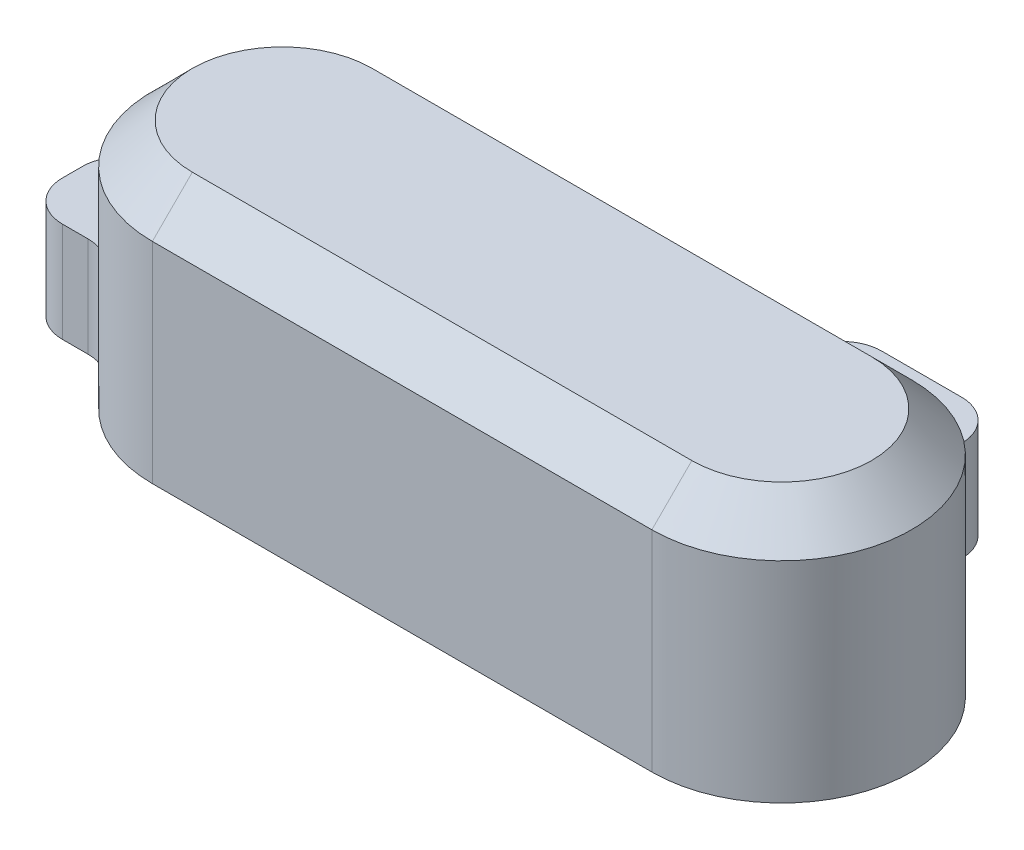
ISO-10303-21;
HEADER;
FILE_DESCRIPTION(('STEP AP214'),'2;1');
FILE_NAME('part.step','',(''),(''),'','','');
FILE_SCHEMA(('AUTOMOTIVE_DESIGN { 1 0 10303 214 1 1 1 1 }'));
ENDSEC;
DATA;
#1=APPLICATION_CONTEXT('core data for automotive mechanical design processes');
#2=APPLICATION_PROTOCOL_DEFINITION('international standard','automotive_design',2000,#1);
#3=PRODUCT_CONTEXT('',#1,'mechanical');
#4=PRODUCT('Part','Part','',(#3));
#5=PRODUCT_RELATED_PRODUCT_CATEGORY('part','',(#4));
#6=PRODUCT_DEFINITION_FORMATION('','',#4);
#7=PRODUCT_DEFINITION_CONTEXT('part definition',#1,'design');
#8=PRODUCT_DEFINITION('design','',#6,#7);
#9=PRODUCT_DEFINITION_SHAPE('','',#8);
#10=(LENGTH_UNIT() NAMED_UNIT(*) SI_UNIT(.MILLI.,.METRE.));
#11=(NAMED_UNIT(*) PLANE_ANGLE_UNIT() SI_UNIT($,.RADIAN.));
#12=(NAMED_UNIT(*) SI_UNIT($,.STERADIAN.) SOLID_ANGLE_UNIT());
#13=UNCERTAINTY_MEASURE_WITH_UNIT(LENGTH_MEASURE(1.E-05),#10,'distance_accuracy_value','');
#14=(GEOMETRIC_REPRESENTATION_CONTEXT(3) GLOBAL_UNCERTAINTY_ASSIGNED_CONTEXT((#13)) GLOBAL_UNIT_ASSIGNED_CONTEXT((#10,
#11,#12)) REPRESENTATION_CONTEXT('',''));
#15=CARTESIAN_POINT('',(0.,0.,0.));
#16=DIRECTION('',(0.,0.,1.));
#17=DIRECTION('',(1.,0.,0.));
#18=AXIS2_PLACEMENT_3D('',#15,#16,#17);
#19=CARTESIAN_POINT('',(-3.175,3.175,0.));
#20=DIRECTION('',(0.,-1.,0.));
#21=DIRECTION('',(0.,0.,-1.));
#22=AXIS2_PLACEMENT_3D('',#19,#20,#21);
#23=CYLINDRICAL_SURFACE('',#22,1.651);
#24=CARTESIAN_POINT('',(-3.175,1.27,0.));
#25=DIRECTION('',(0.,1.,0.));
#26=DIRECTION('',(0.,0.,1.));
#27=AXIS2_PLACEMENT_3D('',#24,#25,#26);
#28=CIRCLE('',#27,1.651);
#29=CARTESIAN_POINT('',(-4.57565062489201,1.27,-0.874058823529412));
#30=VERTEX_POINT('',#29);
#31=CARTESIAN_POINT('',(-4.57565062489201,1.27,0.874058823529411));
#32=VERTEX_POINT('',#31);
#33=EDGE_CURVE('E205',#30,#32,#28,.T.);
#34=ORIENTED_EDGE('',*,*,#33,.T.);
#35=DIRECTION('',(0.,-1.,0.));
#36=VECTOR('',#35,1.);
#37=CARTESIAN_POINT('',(-4.57565062489201,3.175,0.874058823529411));
#38=LINE('',#37,#36);
#39=CARTESIAN_POINT('',(-4.57565062489201,0.,0.874058823529411));
#40=VERTEX_POINT('',#39);
#41=EDGE_CURVE('E190',#32,#40,#38,.T.);
#42=ORIENTED_EDGE('',*,*,#41,.T.);
#43=CARTESIAN_POINT('',(-3.175,0.,0.));
#44=DIRECTION('',(0.,1.,0.));
#45=DIRECTION('',(0.,0.,1.));
#46=AXIS2_PLACEMENT_3D('',#43,#44,#45);
#47=CIRCLE('',#46,1.651);
#48=CARTESIAN_POINT('',(-3.175,0.,1.651));
#49=VERTEX_POINT('',#48);
#50=EDGE_CURVE('E186',#40,#49,#47,.T.);
#51=ORIENTED_EDGE('',*,*,#50,.T.);
#52=DIRECTION('',(0.,-1.,0.));
#53=VECTOR('',#52,1.);
#54=CARTESIAN_POINT('',(-3.175,3.175,1.651));
#55=LINE('',#54,#53);
#56=CARTESIAN_POINT('',(-3.175,2.667,1.651));
#57=VERTEX_POINT('',#56);
#58=EDGE_CURVE('E188',#57,#49,#55,.T.);
#59=ORIENTED_EDGE('',*,*,#58,.F.);
#60=CARTESIAN_POINT('',(-3.175,2.667,0.));
#61=DIRECTION('',(0.,1.,0.));
#62=DIRECTION('',(0.,0.,1.));
#63=AXIS2_PLACEMENT_3D('',#60,#61,#62);
#64=CIRCLE('',#63,1.651);
#65=CARTESIAN_POINT('',(-3.175,2.667,-1.651));
#66=VERTEX_POINT('',#65);
#67=EDGE_CURVE('E239',#57,#66,#64,.F.);
#68=ORIENTED_EDGE('',*,*,#67,.T.);
#69=DIRECTION('',(0.,-1.,0.));
#70=VECTOR('',#69,1.);
#71=CARTESIAN_POINT('',(-3.175,3.175,-1.651));
#72=LINE('',#71,#70);
#73=CARTESIAN_POINT('',(-3.175,0.,-1.651));
#74=VERTEX_POINT('',#73);
#75=EDGE_CURVE('E219',#66,#74,#72,.T.);
#76=ORIENTED_EDGE('',*,*,#75,.T.);
#77=CARTESIAN_POINT('',(-4.57565062489201,0.,-0.874058823529412));
#78=VERTEX_POINT('',#77);
#79=EDGE_CURVE('E193',#74,#78,#47,.T.);
#80=ORIENTED_EDGE('',*,*,#79,.T.);
#81=DIRECTION('',(0.,-1.,0.));
#82=VECTOR('',#81,1.);
#83=CARTESIAN_POINT('',(-4.57565062489201,3.175,-0.874058823529412));
#84=LINE('',#83,#82);
#85=EDGE_CURVE('E276',#78,#30,#84,.F.);
#86=ORIENTED_EDGE('',*,*,#85,.T.);
#87=EDGE_LOOP('',(#34,#42,#51,#59,#68,#76,#80,#86));
#88=FACE_BOUND('',#87,.T.);
#89=ADVANCED_FACE('F34',(#88),#23,.T.);
#90=CARTESIAN_POINT('',(-3.175,3.175,1.651));
#91=DIRECTION('',(0.,0.,-1.));
#92=DIRECTION('',(-1.,0.,0.));
#93=AXIS2_PLACEMENT_3D('',#90,#91,#92);
#94=PLANE('',#93);
#95=DIRECTION('',(0.,-1.,0.));
#96=VECTOR('',#95,1.);
#97=CARTESIAN_POINT('',(3.175,3.175,1.651));
#98=LINE('',#97,#96);
#99=CARTESIAN_POINT('',(3.175,2.667,1.651));
#100=VERTEX_POINT('',#99);
#101=CARTESIAN_POINT('',(3.175,0.,1.651));
#102=VERTEX_POINT('',#101);
#103=EDGE_CURVE('E206',#100,#102,#98,.T.);
#104=ORIENTED_EDGE('',*,*,#103,.F.);
#105=DIRECTION('',(-1.,0.,0.));
#106=VECTOR('',#105,1.);
#107=CARTESIAN_POINT('',(-3.175,2.667,1.651));
#108=LINE('',#107,#106);
#109=EDGE_CURVE('E204',#100,#57,#108,.T.);
#110=ORIENTED_EDGE('',*,*,#109,.T.);
#111=ORIENTED_EDGE('',*,*,#58,.T.);
#112=DIRECTION('',(1.,0.,0.));
#113=VECTOR('',#112,1.);
#114=CARTESIAN_POINT('',(-3.175,0.,1.651));
#115=LINE('',#114,#113);
#116=EDGE_CURVE('E201',#49,#102,#115,.T.);
#117=ORIENTED_EDGE('',*,*,#116,.T.);
#118=EDGE_LOOP('',(#104,#110,#111,#117));
#119=FACE_BOUND('',#118,.T.);
#120=ADVANCED_FACE('F200',(#119),#94,.F.);
#121=CARTESIAN_POINT('',(3.175,3.175,0.));
#122=DIRECTION('',(0.,-1.,0.));
#123=DIRECTION('',(0.,0.,-1.));
#124=AXIS2_PLACEMENT_3D('',#121,#122,#123);
#125=CYLINDRICAL_SURFACE('',#124,1.651);
#126=CARTESIAN_POINT('',(3.175,0.,0.));
#127=DIRECTION('',(0.,1.,0.));
#128=DIRECTION('',(0.,0.,1.));
#129=AXIS2_PLACEMENT_3D('',#126,#127,#128);
#130=CIRCLE('',#129,1.651);
#131=CARTESIAN_POINT('',(3.27211764705882,0.,-1.64814112339622));
#132=VERTEX_POINT('',#131);
#133=EDGE_CURVE('E211',#102,#132,#130,.T.);
#134=ORIENTED_EDGE('',*,*,#133,.T.);
#135=DIRECTION('',(0.,-1.,0.));
#136=VECTOR('',#135,1.);
#137=CARTESIAN_POINT('',(3.27211764705882,3.175,-1.64814112339622));
#138=LINE('',#137,#136);
#139=CARTESIAN_POINT('',(3.27211764705882,1.27,-1.64814112339622));
#140=VERTEX_POINT('',#139);
#141=EDGE_CURVE('E292',#132,#140,#138,.F.);
#142=ORIENTED_EDGE('',*,*,#141,.T.);
#143=CARTESIAN_POINT('',(3.175,1.27,0.));
#144=DIRECTION('',(0.,-1.,0.));
#145=DIRECTION('',(0.,0.,-1.));
#146=AXIS2_PLACEMENT_3D('',#143,#144,#145);
#147=CIRCLE('',#146,1.651);
#148=CARTESIAN_POINT('',(3.175,1.27,-1.651));
#149=VERTEX_POINT('',#148);
#150=EDGE_CURVE('E289',#140,#149,#147,.F.);
#151=ORIENTED_EDGE('',*,*,#150,.T.);
#152=DIRECTION('',(0.,-1.,0.));
#153=VECTOR('',#152,1.);
#154=CARTESIAN_POINT('',(3.175,3.175,-1.651));
#155=LINE('',#154,#153);
#156=CARTESIAN_POINT('',(3.175,2.667,-1.651));
#157=VERTEX_POINT('',#156);
#158=EDGE_CURVE('E222',#157,#149,#155,.T.);
#159=ORIENTED_EDGE('',*,*,#158,.F.);
#160=CARTESIAN_POINT('',(3.175,2.667,0.));
#161=DIRECTION('',(0.,1.,0.));
#162=DIRECTION('',(0.,0.,1.));
#163=AXIS2_PLACEMENT_3D('',#160,#161,#162);
#164=CIRCLE('',#163,1.651);
#165=EDGE_CURVE('E237',#157,#100,#164,.F.);
#166=ORIENTED_EDGE('',*,*,#165,.T.);
#167=ORIENTED_EDGE('',*,*,#103,.T.);
#168=EDGE_LOOP('',(#134,#142,#151,#159,#166,#167));
#169=FACE_BOUND('',#168,.T.);
#170=ADVANCED_FACE('F397',(#169),#125,.T.);
#171=CARTESIAN_POINT('',(-3.175,3.175,-1.651));
#172=DIRECTION('',(0.,0.,1.));
#173=DIRECTION('',(1.,0.,0.));
#174=AXIS2_PLACEMENT_3D('',#171,#172,#173);
#175=PLANE('',#174);
#176=ORIENTED_EDGE('',*,*,#158,.T.);
#177=DIRECTION('',(-1.,0.,0.));
#178=VECTOR('',#177,1.);
#179=CARTESIAN_POINT('',(0.762,1.27,-1.651));
#180=LINE('',#179,#178);
#181=CARTESIAN_POINT('',(0.254,1.27,-1.651));
#182=VERTEX_POINT('',#181);
#183=EDGE_CURVE('E334',#149,#182,#180,.T.);
#184=ORIENTED_EDGE('',*,*,#183,.T.);
#185=DIRECTION('',(0.,-1.,0.));
#186=VECTOR('',#185,1.);
#187=CARTESIAN_POINT('',(0.254,3.175,-1.651));
#188=LINE('',#187,#186);
#189=CARTESIAN_POINT('',(0.254,0.,-1.651));
#190=VERTEX_POINT('',#189);
#191=EDGE_CURVE('E295',#182,#190,#188,.T.);
#192=ORIENTED_EDGE('',*,*,#191,.T.);
#193=DIRECTION('',(-1.,0.,0.));
#194=VECTOR('',#193,1.);
#195=CARTESIAN_POINT('',(-3.175,0.,-1.651));
#196=LINE('',#195,#194);
#197=EDGE_CURVE('E213',#190,#74,#196,.T.);
#198=ORIENTED_EDGE('',*,*,#197,.T.);
#199=ORIENTED_EDGE('',*,*,#75,.F.);
#200=DIRECTION('',(1.,0.,0.));
#201=VECTOR('',#200,1.);
#202=CARTESIAN_POINT('',(3.175,2.667,-1.651));
#203=LINE('',#202,#201);
#204=EDGE_CURVE('E241',#66,#157,#203,.T.);
#205=ORIENTED_EDGE('',*,*,#204,.T.);
#206=EDGE_LOOP('',(#176,#184,#192,#198,#199,#205));
#207=FACE_BOUND('',#206,.T.);
#208=ADVANCED_FACE('F377',(#207),#175,.F.);
#209=CARTESIAN_POINT('',(-3.175,3.175,0.));
#210=DIRECTION('',(0.,1.,0.));
#211=DIRECTION('',(0.,0.,1.));
#212=AXIS2_PLACEMENT_3D('',#209,#210,#211);
#213=PLANE('',#212);
#214=CARTESIAN_POINT('',(-3.175,3.175,0.));
#215=DIRECTION('',(0.,1.,0.));
#216=DIRECTION('',(0.,0.,1.));
#217=AXIS2_PLACEMENT_3D('',#214,#215,#216);
#218=CIRCLE('',#217,1.143);
#219=CARTESIAN_POINT('',(-3.175,3.175,-1.143));
#220=VERTEX_POINT('',#219);
#221=CARTESIAN_POINT('',(-3.175,3.175,1.143));
#222=VERTEX_POINT('',#221);
#223=EDGE_CURVE('E229',#220,#222,#218,.T.);
#224=ORIENTED_EDGE('',*,*,#223,.T.);
#225=DIRECTION('',(1.,0.,0.));
#226=VECTOR('',#225,1.);
#227=CARTESIAN_POINT('',(3.175,3.175,1.143));
#228=LINE('',#227,#226);
#229=CARTESIAN_POINT('',(3.175,3.175,1.143));
#230=VERTEX_POINT('',#229);
#231=EDGE_CURVE('E233',#222,#230,#228,.T.);
#232=ORIENTED_EDGE('',*,*,#231,.T.);
#233=CARTESIAN_POINT('',(3.175,3.175,0.));
#234=DIRECTION('',(0.,1.,0.));
#235=DIRECTION('',(0.,0.,1.));
#236=AXIS2_PLACEMENT_3D('',#233,#234,#235);
#237=CIRCLE('',#236,1.143);
#238=CARTESIAN_POINT('',(3.175,3.175,-1.143));
#239=VERTEX_POINT('',#238);
#240=EDGE_CURVE('E231',#230,#239,#237,.T.);
#241=ORIENTED_EDGE('',*,*,#240,.T.);
#242=DIRECTION('',(-1.,0.,0.));
#243=VECTOR('',#242,1.);
#244=CARTESIAN_POINT('',(-3.175,3.175,-1.143));
#245=LINE('',#244,#243);
#246=EDGE_CURVE('E227',#239,#220,#245,.T.);
#247=ORIENTED_EDGE('',*,*,#246,.T.);
#248=EDGE_LOOP('',(#224,#232,#241,#247));
#249=FACE_BOUND('',#248,.T.);
#250=ADVANCED_FACE('F391',(#249),#213,.T.);
#251=CARTESIAN_POINT('',(-3.175,0.,0.));
#252=DIRECTION('',(0.,1.,0.));
#253=DIRECTION('',(0.,0.,1.));
#254=AXIS2_PLACEMENT_3D('',#251,#252,#253);
#255=PLANE('',#254);
#256=DIRECTION('',(-1.,0.,0.));
#257=VECTOR('',#256,1.);
#258=CARTESIAN_POINT('',(-3.81,0.,0.635));
#259=LINE('',#258,#257);
#260=CARTESIAN_POINT('',(-5.00662004793571,0.,0.634999999999999));
#261=VERTEX_POINT('',#260);
#262=CARTESIAN_POINT('',(-5.334,0.,0.634999999999999));
#263=VERTEX_POINT('',#262);
#264=EDGE_CURVE('E347',#261,#263,#259,.T.);
#265=ORIENTED_EDGE('',*,*,#264,.T.);
#266=CARTESIAN_POINT('',(-5.334,0.,0.126999999999999));
#267=DIRECTION('',(0.,1.,0.));
#268=DIRECTION('',(0.,0.,1.));
#269=AXIS2_PLACEMENT_3D('',#266,#267,#268);
#270=CIRCLE('',#269,0.508);
#271=CARTESIAN_POINT('',(-5.842,0.,0.126999999999999));
#272=VERTEX_POINT('',#271);
#273=EDGE_CURVE('E265',#263,#272,#270,.F.);
#274=ORIENTED_EDGE('',*,*,#273,.T.);
#275=DIRECTION('',(0.,0.,-1.));
#276=VECTOR('',#275,1.);
#277=CARTESIAN_POINT('',(-5.842,0.,0.634999999999999));
#278=LINE('',#277,#276);
#279=CARTESIAN_POINT('',(-5.842,0.,-0.127));
#280=VERTEX_POINT('',#279);
#281=EDGE_CURVE('E361',#272,#280,#278,.T.);
#282=ORIENTED_EDGE('',*,*,#281,.T.);
#283=CARTESIAN_POINT('',(-5.334,0.,-0.127));
#284=DIRECTION('',(0.,1.,0.));
#285=DIRECTION('',(0.,0.,1.));
#286=AXIS2_PLACEMENT_3D('',#283,#284,#285);
#287=CIRCLE('',#286,0.508);
#288=CARTESIAN_POINT('',(-5.334,0.,-0.635));
#289=VERTEX_POINT('',#288);
#290=EDGE_CURVE('E263',#280,#289,#287,.F.);
#291=ORIENTED_EDGE('',*,*,#290,.T.);
#292=DIRECTION('',(1.,0.,0.));
#293=VECTOR('',#292,1.);
#294=CARTESIAN_POINT('',(-3.81,0.,-0.635));
#295=LINE('',#294,#293);
#296=CARTESIAN_POINT('',(-5.00662004793571,0.,-0.635));
#297=VERTEX_POINT('',#296);
#298=EDGE_CURVE('E355',#289,#297,#295,.T.);
#299=ORIENTED_EDGE('',*,*,#298,.T.);
#300=CARTESIAN_POINT('',(-5.00662004793571,0.,-1.143));
#301=DIRECTION('',(0.,1.,0.));
#302=DIRECTION('',(0.,0.,1.));
#303=AXIS2_PLACEMENT_3D('',#300,#301,#302);
#304=CIRCLE('',#303,0.508);
#305=EDGE_CURVE('E317',#297,#78,#304,.T.);
#306=ORIENTED_EDGE('',*,*,#305,.T.);
#307=ORIENTED_EDGE('',*,*,#79,.F.);
#308=ORIENTED_EDGE('',*,*,#197,.F.);
#309=CARTESIAN_POINT('',(0.254,0.,-2.159));
#310=DIRECTION('',(0.,1.,0.));
#311=DIRECTION('',(0.,0.,1.));
#312=AXIS2_PLACEMENT_3D('',#309,#310,#311);
#313=CIRCLE('',#312,0.508);
#314=CARTESIAN_POINT('',(0.762,0.,-2.159));
#315=VERTEX_POINT('',#314);
#316=EDGE_CURVE('E42',#190,#315,#313,.T.);
#317=ORIENTED_EDGE('',*,*,#316,.T.);
#318=DIRECTION('',(0.,0.,-1.));
#319=VECTOR('',#318,1.);
#320=CARTESIAN_POINT('',(0.762,0.,-1.651));
#321=LINE('',#320,#319);
#322=CARTESIAN_POINT('',(0.762,0.,-2.667));
#323=VERTEX_POINT('',#322);
#324=EDGE_CURVE('E254',#315,#323,#321,.T.);
#325=ORIENTED_EDGE('',*,*,#324,.T.);
#326=CARTESIAN_POINT('',(1.27,0.,-2.667));
#327=DIRECTION('',(0.,1.,0.));
#328=DIRECTION('',(0.,0.,1.));
#329=AXIS2_PLACEMENT_3D('',#326,#327,#328);
#330=CIRCLE('',#329,0.508);
#331=CARTESIAN_POINT('',(1.27,0.,-3.175));
#332=VERTEX_POINT('',#331);
#333=EDGE_CURVE('E259',#323,#332,#330,.F.);
#334=ORIENTED_EDGE('',*,*,#333,.T.);
#335=DIRECTION('',(1.,0.,0.));
#336=VECTOR('',#335,1.);
#337=CARTESIAN_POINT('',(0.762,0.,-3.175));
#338=LINE('',#337,#336);
#339=CARTESIAN_POINT('',(2.286,0.,-3.175));
#340=VERTEX_POINT('',#339);
#341=EDGE_CURVE('E329',#332,#340,#338,.T.);
#342=ORIENTED_EDGE('',*,*,#341,.T.);
#343=CARTESIAN_POINT('',(2.286,0.,-2.667));
#344=DIRECTION('',(0.,1.,0.));
#345=DIRECTION('',(0.,0.,1.));
#346=AXIS2_PLACEMENT_3D('',#343,#344,#345);
#347=CIRCLE('',#346,0.508);
#348=CARTESIAN_POINT('',(2.794,0.,-2.667));
#349=VERTEX_POINT('',#348);
#350=EDGE_CURVE('E261',#340,#349,#347,.F.);
#351=ORIENTED_EDGE('',*,*,#350,.T.);
#352=DIRECTION('',(0.,0.,1.));
#353=VECTOR('',#352,1.);
#354=CARTESIAN_POINT('',(2.794,0.,-1.651));
#355=LINE('',#354,#353);
#356=CARTESIAN_POINT('',(2.794,0.,-2.1552614690566));
#357=VERTEX_POINT('',#356);
#358=EDGE_CURVE('E337',#349,#357,#355,.T.);
#359=ORIENTED_EDGE('',*,*,#358,.T.);
#360=CARTESIAN_POINT('',(3.302,0.,-2.1552614690566));
#361=DIRECTION('',(0.,1.,0.));
#362=DIRECTION('',(0.,0.,1.));
#363=AXIS2_PLACEMENT_3D('',#360,#361,#362);
#364=CIRCLE('',#363,0.508);
#365=EDGE_CURVE('E319',#357,#132,#364,.T.);
#366=ORIENTED_EDGE('',*,*,#365,.T.);
#367=ORIENTED_EDGE('',*,*,#133,.F.);
#368=ORIENTED_EDGE('',*,*,#116,.F.);
#369=ORIENTED_EDGE('',*,*,#50,.F.);
#370=CARTESIAN_POINT('',(-5.00662004793571,0.,1.143));
#371=DIRECTION('',(0.,1.,0.));
#372=DIRECTION('',(0.,0.,1.));
#373=AXIS2_PLACEMENT_3D('',#370,#371,#372);
#374=CIRCLE('',#373,0.508);
#375=EDGE_CURVE('E310',#40,#261,#374,.T.);
#376=ORIENTED_EDGE('',*,*,#375,.T.);
#377=EDGE_LOOP('',(#265,#274,#282,#291,#299,#306,#307,#308,#317,#325,#334,#342,#351,#359,#366,
#367,#368,#369,#376));
#378=FACE_BOUND('',#377,.T.);
#379=ADVANCED_FACE('F209',(#378),#255,.F.);
#380=CARTESIAN_POINT('',(-3.81,1.27,-0.635));
#381=DIRECTION('',(0.,0.,-1.));
#382=DIRECTION('',(-1.,0.,0.));
#383=AXIS2_PLACEMENT_3D('',#380,#381,#382);
#384=PLANE('',#383);
#385=DIRECTION('',(1.,0.,0.));
#386=VECTOR('',#385,1.);
#387=CARTESIAN_POINT('',(-3.81,1.27,-0.635));
#388=LINE('',#387,#386);
#389=CARTESIAN_POINT('',(-5.334,1.27,-0.635));
#390=VERTEX_POINT('',#389);
#391=CARTESIAN_POINT('',(-5.00662004793571,1.27,-0.635));
#392=VERTEX_POINT('',#391);
#393=EDGE_CURVE('E194',#390,#392,#388,.T.);
#394=ORIENTED_EDGE('',*,*,#393,.T.);
#395=DIRECTION('',(0.,-1.,0.));
#396=VECTOR('',#395,1.);
#397=CARTESIAN_POINT('',(-5.00662004793571,1.27,-0.635));
#398=LINE('',#397,#396);
#399=EDGE_CURVE('E282',#392,#297,#398,.T.);
#400=ORIENTED_EDGE('',*,*,#399,.T.);
#401=ORIENTED_EDGE('',*,*,#298,.F.);
#402=DIRECTION('',(0.,-1.,0.));
#403=VECTOR('',#402,1.);
#404=CARTESIAN_POINT('',(-5.334,1.27,-0.635));
#405=LINE('',#404,#403);
#406=EDGE_CURVE('E280',#289,#390,#405,.F.);
#407=ORIENTED_EDGE('',*,*,#406,.T.);
#408=EDGE_LOOP('',(#394,#400,#401,#407));
#409=FACE_BOUND('',#408,.T.);
#410=ADVANCED_FACE('F424',(#409),#384,.T.);
#411=CARTESIAN_POINT('',(-3.81,1.27,0.635));
#412=DIRECTION('',(0.,0.,1.));
#413=DIRECTION('',(1.,0.,0.));
#414=AXIS2_PLACEMENT_3D('',#411,#412,#413);
#415=PLANE('',#414);
#416=DIRECTION('',(-1.,0.,0.));
#417=VECTOR('',#416,1.);
#418=CARTESIAN_POINT('',(-3.81,1.27,0.635));
#419=LINE('',#418,#417);
#420=CARTESIAN_POINT('',(-5.00662004793571,1.27,0.634999999999999));
#421=VERTEX_POINT('',#420);
#422=CARTESIAN_POINT('',(-5.334,1.27,0.634999999999999));
#423=VERTEX_POINT('',#422);
#424=EDGE_CURVE('E351',#421,#423,#419,.T.);
#425=ORIENTED_EDGE('',*,*,#424,.T.);
#426=DIRECTION('',(0.,-1.,0.));
#427=VECTOR('',#426,1.);
#428=CARTESIAN_POINT('',(-5.334,1.27,0.634999999999999));
#429=LINE('',#428,#427);
#430=EDGE_CURVE('E256',#423,#263,#429,.T.);
#431=ORIENTED_EDGE('',*,*,#430,.T.);
#432=ORIENTED_EDGE('',*,*,#264,.F.);
#433=DIRECTION('',(0.,-1.,0.));
#434=VECTOR('',#433,1.);
#435=CARTESIAN_POINT('',(-5.00662004793571,1.27,0.634999999999999));
#436=LINE('',#435,#434);
#437=EDGE_CURVE('E243',#261,#421,#436,.F.);
#438=ORIENTED_EDGE('',*,*,#437,.T.);
#439=EDGE_LOOP('',(#425,#431,#432,#438));
#440=FACE_BOUND('',#439,.T.);
#441=ADVANCED_FACE('F427',(#440),#415,.T.);
#442=CARTESIAN_POINT('',(-5.842,1.27,0.634999999999999));
#443=DIRECTION('',(-1.,0.,0.));
#444=DIRECTION('',(0.,0.,1.));
#445=AXIS2_PLACEMENT_3D('',#442,#443,#444);
#446=PLANE('',#445);
#447=ORIENTED_EDGE('',*,*,#281,.F.);
#448=DIRECTION('',(0.,-1.,0.));
#449=VECTOR('',#448,1.);
#450=CARTESIAN_POINT('',(-5.842,1.27,0.126999999999999));
#451=LINE('',#450,#449);
#452=CARTESIAN_POINT('',(-5.842,1.27,0.126999999999999));
#453=VERTEX_POINT('',#452);
#454=EDGE_CURVE('E270',#272,#453,#451,.F.);
#455=ORIENTED_EDGE('',*,*,#454,.T.);
#456=DIRECTION('',(0.,0.,-1.));
#457=VECTOR('',#456,1.);
#458=CARTESIAN_POINT('',(-5.842,1.27,0.634999999999999));
#459=LINE('',#458,#457);
#460=CARTESIAN_POINT('',(-5.842,1.27,-0.127));
#461=VERTEX_POINT('',#460);
#462=EDGE_CURVE('E354',#453,#461,#459,.T.);
#463=ORIENTED_EDGE('',*,*,#462,.T.);
#464=DIRECTION('',(0.,-1.,0.));
#465=VECTOR('',#464,1.);
#466=CARTESIAN_POINT('',(-5.842,1.27,-0.127));
#467=LINE('',#466,#465);
#468=EDGE_CURVE('E267',#461,#280,#467,.T.);
#469=ORIENTED_EDGE('',*,*,#468,.T.);
#470=EDGE_LOOP('',(#447,#455,#463,#469));
#471=FACE_BOUND('',#470,.T.);
#472=ADVANCED_FACE('F430',(#471),#446,.T.);
#473=CARTESIAN_POINT('',(0.,1.27,0.));
#474=DIRECTION('',(0.,1.,0.));
#475=DIRECTION('',(0.,0.,1.));
#476=AXIS2_PLACEMENT_3D('',#473,#474,#475);
#477=PLANE('',#476);
#478=ORIENTED_EDGE('',*,*,#462,.F.);
#479=CARTESIAN_POINT('',(-5.334,1.27,0.126999999999999));
#480=DIRECTION('',(0.,1.,0.));
#481=DIRECTION('',(0.,0.,1.));
#482=AXIS2_PLACEMENT_3D('',#479,#480,#481);
#483=CIRCLE('',#482,0.508);
#484=EDGE_CURVE('E274',#453,#423,#483,.T.);
#485=ORIENTED_EDGE('',*,*,#484,.T.);
#486=ORIENTED_EDGE('',*,*,#424,.F.);
#487=CARTESIAN_POINT('',(-5.00662004793571,1.27,1.143));
#488=DIRECTION('',(0.,1.,0.));
#489=DIRECTION('',(0.,0.,1.));
#490=AXIS2_PLACEMENT_3D('',#487,#488,#489);
#491=CIRCLE('',#490,0.508);
#492=EDGE_CURVE('E312',#421,#32,#491,.F.);
#493=ORIENTED_EDGE('',*,*,#492,.T.);
#494=ORIENTED_EDGE('',*,*,#33,.F.);
#495=CARTESIAN_POINT('',(-5.00662004793571,1.27,-1.143));
#496=DIRECTION('',(0.,1.,0.));
#497=DIRECTION('',(0.,0.,1.));
#498=AXIS2_PLACEMENT_3D('',#495,#496,#497);
#499=CIRCLE('',#498,0.508);
#500=EDGE_CURVE('E315',#30,#392,#499,.F.);
#501=ORIENTED_EDGE('',*,*,#500,.T.);
#502=ORIENTED_EDGE('',*,*,#393,.F.);
#503=CARTESIAN_POINT('',(-5.334,1.27,-0.127));
#504=DIRECTION('',(0.,1.,0.));
#505=DIRECTION('',(0.,0.,1.));
#506=AXIS2_PLACEMENT_3D('',#503,#504,#505);
#507=CIRCLE('',#506,0.508);
#508=EDGE_CURVE('E272',#390,#461,#507,.T.);
#509=ORIENTED_EDGE('',*,*,#508,.T.);
#510=EDGE_LOOP('',(#478,#485,#486,#493,#494,#501,#502,#509));
#511=FACE_BOUND('',#510,.T.);
#512=ADVANCED_FACE('F434',(#511),#477,.T.);
#513=CARTESIAN_POINT('',(0.762,1.27,-1.651));
#514=DIRECTION('',(-1.,0.,0.));
#515=DIRECTION('',(0.,0.,1.));
#516=AXIS2_PLACEMENT_3D('',#513,#514,#515);
#517=PLANE('',#516);
#518=DIRECTION('',(0.,0.,-1.));
#519=VECTOR('',#518,1.);
#520=CARTESIAN_POINT('',(0.762,1.27,-1.651));
#521=LINE('',#520,#519);
#522=CARTESIAN_POINT('',(0.762,1.27,-2.159));
#523=VERTEX_POINT('',#522);
#524=CARTESIAN_POINT('',(0.762,1.27,-2.667));
#525=VERTEX_POINT('',#524);
#526=EDGE_CURVE('E335',#523,#525,#521,.T.);
#527=ORIENTED_EDGE('',*,*,#526,.T.);
#528=DIRECTION('',(0.,-1.,0.));
#529=VECTOR('',#528,1.);
#530=CARTESIAN_POINT('',(0.762,1.27,-2.667));
#531=LINE('',#530,#529);
#532=EDGE_CURVE('E307',#525,#323,#531,.T.);
#533=ORIENTED_EDGE('',*,*,#532,.T.);
#534=ORIENTED_EDGE('',*,*,#324,.F.);
#535=DIRECTION('',(0.,-1.,0.));
#536=VECTOR('',#535,1.);
#537=CARTESIAN_POINT('',(0.762,1.27,-2.159));
#538=LINE('',#537,#536);
#539=EDGE_CURVE('E56',#315,#523,#538,.F.);
#540=ORIENTED_EDGE('',*,*,#539,.T.);
#541=EDGE_LOOP('',(#527,#533,#534,#540));
#542=FACE_BOUND('',#541,.T.);
#543=ADVANCED_FACE('F327',(#542),#517,.T.);
#544=CARTESIAN_POINT('',(2.794,1.27,-1.651));
#545=DIRECTION('',(1.,0.,0.));
#546=DIRECTION('',(0.,0.,-1.));
#547=AXIS2_PLACEMENT_3D('',#544,#545,#546);
#548=PLANE('',#547);
#549=DIRECTION('',(0.,0.,1.));
#550=VECTOR('',#549,1.);
#551=CARTESIAN_POINT('',(2.794,1.27,-1.651));
#552=LINE('',#551,#550);
#553=CARTESIAN_POINT('',(2.794,1.27,-2.667));
#554=VERTEX_POINT('',#553);
#555=CARTESIAN_POINT('',(2.794,1.27,-2.1552614690566));
#556=VERTEX_POINT('',#555);
#557=EDGE_CURVE('E340',#554,#556,#552,.T.);
#558=ORIENTED_EDGE('',*,*,#557,.T.);
#559=DIRECTION('',(0.,-1.,0.));
#560=VECTOR('',#559,1.);
#561=CARTESIAN_POINT('',(2.794,1.27,-2.1552614690566));
#562=LINE('',#561,#560);
#563=EDGE_CURVE('E286',#556,#357,#562,.T.);
#564=ORIENTED_EDGE('',*,*,#563,.T.);
#565=ORIENTED_EDGE('',*,*,#358,.F.);
#566=DIRECTION('',(0.,-1.,0.));
#567=VECTOR('',#566,1.);
#568=CARTESIAN_POINT('',(2.794,1.27,-2.667));
#569=LINE('',#568,#567);
#570=EDGE_CURVE('E284',#349,#554,#569,.F.);
#571=ORIENTED_EDGE('',*,*,#570,.T.);
#572=EDGE_LOOP('',(#558,#564,#565,#571));
#573=FACE_BOUND('',#572,.T.);
#574=ADVANCED_FACE('F443',(#573),#548,.T.);
#575=CARTESIAN_POINT('',(0.762,1.27,-3.175));
#576=DIRECTION('',(0.,0.,-1.));
#577=DIRECTION('',(-1.,0.,0.));
#578=AXIS2_PLACEMENT_3D('',#575,#576,#577);
#579=PLANE('',#578);
#580=DIRECTION('',(1.,0.,0.));
#581=VECTOR('',#580,1.);
#582=CARTESIAN_POINT('',(0.762,1.27,-3.175));
#583=LINE('',#582,#581);
#584=CARTESIAN_POINT('',(1.27,1.27,-3.175));
#585=VERTEX_POINT('',#584);
#586=CARTESIAN_POINT('',(2.286,1.27,-3.175));
#587=VERTEX_POINT('',#586);
#588=EDGE_CURVE('E336',#585,#587,#583,.T.);
#589=ORIENTED_EDGE('',*,*,#588,.T.);
#590=DIRECTION('',(0.,-1.,0.));
#591=VECTOR('',#590,1.);
#592=CARTESIAN_POINT('',(2.286,1.27,-3.175));
#593=LINE('',#592,#591);
#594=EDGE_CURVE('E300',#587,#340,#593,.T.);
#595=ORIENTED_EDGE('',*,*,#594,.T.);
#596=ORIENTED_EDGE('',*,*,#341,.F.);
#597=DIRECTION('',(0.,-1.,0.));
#598=VECTOR('',#597,1.);
#599=CARTESIAN_POINT('',(1.27,1.27,-3.175));
#600=LINE('',#599,#598);
#601=EDGE_CURVE('E298',#332,#585,#600,.F.);
#602=ORIENTED_EDGE('',*,*,#601,.T.);
#603=EDGE_LOOP('',(#589,#595,#596,#602));
#604=FACE_BOUND('',#603,.T.);
#605=ADVANCED_FACE('F444',(#604),#579,.T.);
#606=CARTESIAN_POINT('',(0.,1.27,0.));
#607=DIRECTION('',(0.,-1.,0.));
#608=DIRECTION('',(0.,0.,-1.));
#609=AXIS2_PLACEMENT_3D('',#606,#607,#608);
#610=PLANE('',#609);
#611=ORIENTED_EDGE('',*,*,#557,.F.);
#612=CARTESIAN_POINT('',(2.286,1.27,-2.667));
#613=DIRECTION('',(0.,-1.,0.));
#614=DIRECTION('',(0.,0.,-1.));
#615=AXIS2_PLACEMENT_3D('',#612,#613,#614);
#616=CIRCLE('',#615,0.508);
#617=EDGE_CURVE('E304',#554,#587,#616,.F.);
#618=ORIENTED_EDGE('',*,*,#617,.T.);
#619=ORIENTED_EDGE('',*,*,#588,.F.);
#620=CARTESIAN_POINT('',(1.27,1.27,-2.667));
#621=DIRECTION('',(0.,-1.,0.));
#622=DIRECTION('',(0.,0.,-1.));
#623=AXIS2_PLACEMENT_3D('',#620,#621,#622);
#624=CIRCLE('',#623,0.508);
#625=EDGE_CURVE('E49',#585,#525,#624,.F.);
#626=ORIENTED_EDGE('',*,*,#625,.T.);
#627=ORIENTED_EDGE('',*,*,#526,.F.);
#628=CARTESIAN_POINT('',(0.254,1.27,-2.159));
#629=DIRECTION('',(0.,-1.,0.));
#630=DIRECTION('',(0.,0.,-1.));
#631=AXIS2_PLACEMENT_3D('',#628,#629,#630);
#632=CIRCLE('',#631,0.508);
#633=EDGE_CURVE('E11',#523,#182,#632,.T.);
#634=ORIENTED_EDGE('',*,*,#633,.T.);
#635=ORIENTED_EDGE('',*,*,#183,.F.);
#636=ORIENTED_EDGE('',*,*,#150,.F.);
#637=CARTESIAN_POINT('',(3.302,1.27,-2.1552614690566));
#638=DIRECTION('',(0.,-1.,0.));
#639=DIRECTION('',(0.,0.,-1.));
#640=AXIS2_PLACEMENT_3D('',#637,#638,#639);
#641=CIRCLE('',#640,0.508);
#642=EDGE_CURVE('E321',#140,#556,#641,.T.);
#643=ORIENTED_EDGE('',*,*,#642,.T.);
#644=EDGE_LOOP('',(#611,#618,#619,#626,#627,#634,#635,#636,#643));
#645=FACE_BOUND('',#644,.T.);
#646=ADVANCED_FACE('F333',(#645),#610,.F.);
#647=CARTESIAN_POINT('',(-3.175,3.175,-1.143));
#648=DIRECTION('',(0.,0.707106781186546,-0.707106781186549));
#649=DIRECTION('',(1.,0.,0.));
#650=AXIS2_PLACEMENT_3D('',#647,#648,#649);
#651=PLANE('',#650);
#652=DIRECTION('',(0.,0.707106781186549,0.707106781186546));
#653=VECTOR('',#652,1.);
#654=CARTESIAN_POINT('',(3.175,2.667,-1.651));
#655=LINE('',#654,#653);
#656=EDGE_CURVE('E248',#157,#239,#655,.T.);
#657=ORIENTED_EDGE('',*,*,#656,.F.);
#658=ORIENTED_EDGE('',*,*,#204,.F.);
#659=DIRECTION('',(0.,-0.707106781186549,-0.707106781186546));
#660=VECTOR('',#659,1.);
#661=CARTESIAN_POINT('',(-3.175,3.175,-1.143));
#662=LINE('',#661,#660);
#663=EDGE_CURVE('E251',#220,#66,#662,.T.);
#664=ORIENTED_EDGE('',*,*,#663,.F.);
#665=ORIENTED_EDGE('',*,*,#246,.F.);
#666=EDGE_LOOP('',(#657,#658,#664,#665));
#667=FACE_BOUND('',#666,.T.);
#668=ADVANCED_FACE('F382',(#667),#651,.T.);
#669=CARTESIAN_POINT('',(-3.175,3.175,0.));
#670=DIRECTION('',(0.,-1.,0.));
#671=DIRECTION('',(0.,0.,-1.));
#672=AXIS2_PLACEMENT_3D('',#669,#670,#671);
#673=CONICAL_SURFACE('',#672,1.143,0.785398163397447);
#674=ORIENTED_EDGE('',*,*,#663,.T.);
#675=ORIENTED_EDGE('',*,*,#67,.F.);
#676=DIRECTION('',(0.,-0.707106781186549,0.707106781186546));
#677=VECTOR('',#676,1.);
#678=CARTESIAN_POINT('',(-3.175,3.175,1.143));
#679=LINE('',#678,#677);
#680=EDGE_CURVE('E246',#222,#57,#679,.T.);
#681=ORIENTED_EDGE('',*,*,#680,.F.);
#682=ORIENTED_EDGE('',*,*,#223,.F.);
#683=EDGE_LOOP('',(#674,#675,#681,#682));
#684=FACE_BOUND('',#683,.T.);
#685=ADVANCED_FACE('F387',(#684),#673,.T.);
#686=CARTESIAN_POINT('',(3.175,3.175,0.));
#687=DIRECTION('',(0.,-1.,0.));
#688=DIRECTION('',(0.,0.,-1.));
#689=AXIS2_PLACEMENT_3D('',#686,#687,#688);
#690=CONICAL_SURFACE('',#689,1.143,0.785398163397447);
#691=ORIENTED_EDGE('',*,*,#656,.T.);
#692=ORIENTED_EDGE('',*,*,#240,.F.);
#693=DIRECTION('',(0.,0.707106781186549,-0.707106781186546));
#694=VECTOR('',#693,1.);
#695=CARTESIAN_POINT('',(3.175,2.667,1.651));
#696=LINE('',#695,#694);
#697=EDGE_CURVE('E244',#100,#230,#696,.T.);
#698=ORIENTED_EDGE('',*,*,#697,.F.);
#699=ORIENTED_EDGE('',*,*,#165,.F.);
#700=EDGE_LOOP('',(#691,#692,#698,#699));
#701=FACE_BOUND('',#700,.T.);
#702=ADVANCED_FACE('F394',(#701),#690,.T.);
#703=CARTESIAN_POINT('',(-3.175,3.175,1.143));
#704=DIRECTION('',(0.,0.707106781186546,0.707106781186549));
#705=DIRECTION('',(-1.,0.,0.));
#706=AXIS2_PLACEMENT_3D('',#703,#704,#705);
#707=PLANE('',#706);
#708=ORIENTED_EDGE('',*,*,#680,.T.);
#709=ORIENTED_EDGE('',*,*,#109,.F.);
#710=ORIENTED_EDGE('',*,*,#697,.T.);
#711=ORIENTED_EDGE('',*,*,#231,.F.);
#712=EDGE_LOOP('',(#708,#709,#710,#711));
#713=FACE_BOUND('',#712,.T.);
#714=ADVANCED_FACE('F399',(#713),#707,.T.);
#715=CARTESIAN_POINT('',(-5.334,1.27,0.126999999999999));
#716=DIRECTION('',(0.,-1.,0.));
#717=DIRECTION('',(0.,0.,-1.));
#718=AXIS2_PLACEMENT_3D('',#715,#716,#717);
#719=CYLINDRICAL_SURFACE('',#718,0.508);
#720=ORIENTED_EDGE('',*,*,#484,.F.);
#721=ORIENTED_EDGE('',*,*,#454,.F.);
#722=ORIENTED_EDGE('',*,*,#273,.F.);
#723=ORIENTED_EDGE('',*,*,#430,.F.);
#724=EDGE_LOOP('',(#720,#721,#722,#723));
#725=FACE_BOUND('',#724,.T.);
#726=ADVANCED_FACE('F401',(#725),#719,.T.);
#727=CARTESIAN_POINT('',(-5.00662004793571,3.175,1.143));
#728=DIRECTION('',(0.,-1.,0.));
#729=DIRECTION('',(0.,0.,-1.));
#730=AXIS2_PLACEMENT_3D('',#727,#728,#729);
#731=CYLINDRICAL_SURFACE('',#730,0.508);
#732=ORIENTED_EDGE('',*,*,#492,.F.);
#733=ORIENTED_EDGE('',*,*,#437,.F.);
#734=ORIENTED_EDGE('',*,*,#375,.F.);
#735=ORIENTED_EDGE('',*,*,#41,.F.);
#736=EDGE_LOOP('',(#732,#733,#734,#735));
#737=FACE_BOUND('',#736,.T.);
#738=ADVANCED_FACE('F407',(#737),#731,.F.);
#739=CARTESIAN_POINT('',(-5.00662004793571,3.175,-1.143));
#740=DIRECTION('',(0.,-1.,0.));
#741=DIRECTION('',(0.,0.,-1.));
#742=AXIS2_PLACEMENT_3D('',#739,#740,#741);
#743=CYLINDRICAL_SURFACE('',#742,0.508);
#744=ORIENTED_EDGE('',*,*,#305,.F.);
#745=ORIENTED_EDGE('',*,*,#399,.F.);
#746=ORIENTED_EDGE('',*,*,#500,.F.);
#747=ORIENTED_EDGE('',*,*,#85,.F.);
#748=EDGE_LOOP('',(#744,#745,#746,#747));
#749=FACE_BOUND('',#748,.T.);
#750=ADVANCED_FACE('F371',(#749),#743,.F.);
#751=CARTESIAN_POINT('',(-5.334,1.27,-0.127));
#752=DIRECTION('',(0.,-1.,0.));
#753=DIRECTION('',(0.,0.,-1.));
#754=AXIS2_PLACEMENT_3D('',#751,#752,#753);
#755=CYLINDRICAL_SURFACE('',#754,0.508);
#756=ORIENTED_EDGE('',*,*,#508,.F.);
#757=ORIENTED_EDGE('',*,*,#406,.F.);
#758=ORIENTED_EDGE('',*,*,#290,.F.);
#759=ORIENTED_EDGE('',*,*,#468,.F.);
#760=EDGE_LOOP('',(#756,#757,#758,#759));
#761=FACE_BOUND('',#760,.T.);
#762=ADVANCED_FACE('F466',(#761),#755,.T.);
#763=CARTESIAN_POINT('',(3.302,3.175,-2.1552614690566));
#764=DIRECTION('',(0.,-1.,0.));
#765=DIRECTION('',(0.,0.,-1.));
#766=AXIS2_PLACEMENT_3D('',#763,#764,#765);
#767=CYLINDRICAL_SURFACE('',#766,0.508);
#768=ORIENTED_EDGE('',*,*,#642,.F.);
#769=ORIENTED_EDGE('',*,*,#141,.F.);
#770=ORIENTED_EDGE('',*,*,#365,.F.);
#771=ORIENTED_EDGE('',*,*,#563,.F.);
#772=EDGE_LOOP('',(#768,#769,#770,#771));
#773=FACE_BOUND('',#772,.T.);
#774=ADVANCED_FACE('F469',(#773),#767,.F.);
#775=CARTESIAN_POINT('',(2.286,1.27,-2.667));
#776=DIRECTION('',(0.,-1.,0.));
#777=DIRECTION('',(0.,0.,-1.));
#778=AXIS2_PLACEMENT_3D('',#775,#776,#777);
#779=CYLINDRICAL_SURFACE('',#778,0.508);
#780=ORIENTED_EDGE('',*,*,#617,.F.);
#781=ORIENTED_EDGE('',*,*,#570,.F.);
#782=ORIENTED_EDGE('',*,*,#350,.F.);
#783=ORIENTED_EDGE('',*,*,#594,.F.);
#784=EDGE_LOOP('',(#780,#781,#782,#783));
#785=FACE_BOUND('',#784,.T.);
#786=ADVANCED_FACE('F473',(#785),#779,.T.);
#787=CARTESIAN_POINT('',(1.27,1.27,-2.667));
#788=DIRECTION('',(0.,-1.,0.));
#789=DIRECTION('',(0.,0.,-1.));
#790=AXIS2_PLACEMENT_3D('',#787,#788,#789);
#791=CYLINDRICAL_SURFACE('',#790,0.508);
#792=ORIENTED_EDGE('',*,*,#625,.F.);
#793=ORIENTED_EDGE('',*,*,#601,.F.);
#794=ORIENTED_EDGE('',*,*,#333,.F.);
#795=ORIENTED_EDGE('',*,*,#532,.F.);
#796=EDGE_LOOP('',(#792,#793,#794,#795));
#797=FACE_BOUND('',#796,.T.);
#798=ADVANCED_FACE('F476',(#797),#791,.T.);
#799=CARTESIAN_POINT('',(0.254,3.175,-2.159));
#800=DIRECTION('',(0.,-1.,0.));
#801=DIRECTION('',(0.,0.,-1.));
#802=AXIS2_PLACEMENT_3D('',#799,#800,#801);
#803=CYLINDRICAL_SURFACE('',#802,0.508);
#804=ORIENTED_EDGE('',*,*,#633,.F.);
#805=ORIENTED_EDGE('',*,*,#539,.F.);
#806=ORIENTED_EDGE('',*,*,#316,.F.);
#807=ORIENTED_EDGE('',*,*,#191,.F.);
#808=EDGE_LOOP('',(#804,#805,#806,#807));
#809=FACE_BOUND('',#808,.T.);
#810=ADVANCED_FACE('F36',(#809),#803,.F.);
#811=CLOSED_SHELL('',(#89,#120,#170,#208,#250,#379,#410,#441,#472,#512,#543,#574,#605,#646,#668,
#685,#702,#714,#726,#738,#750,#762,#774,#786,#798,#810));
#812=MANIFOLD_SOLID_BREP('B2',#811);
#813=ADVANCED_BREP_SHAPE_REPRESENTATION('',(#18,#812),#14);
#814=SHAPE_DEFINITION_REPRESENTATION(#9,#813);
ENDSEC;
END-ISO-10303-21;
